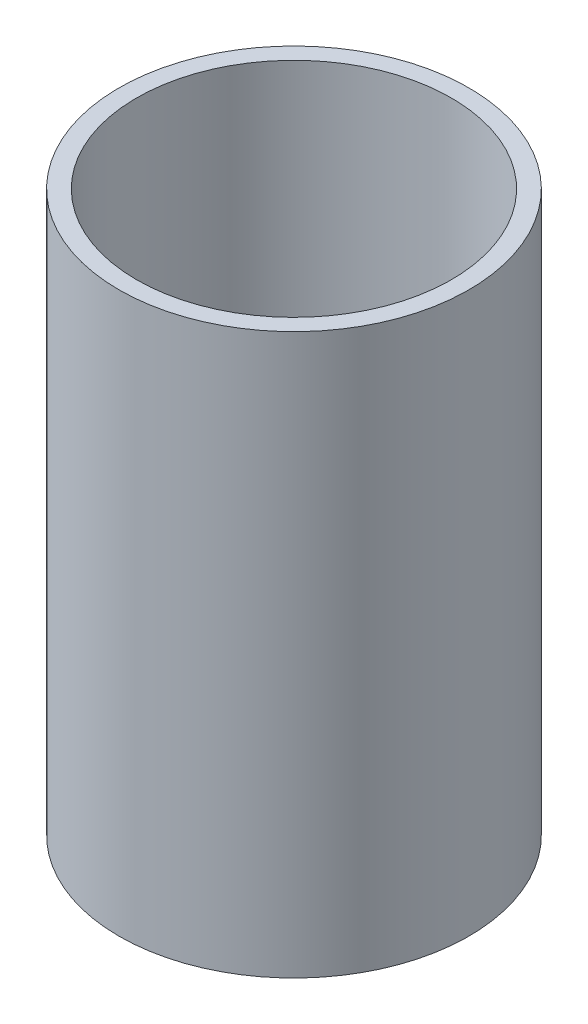
ISO-10303-21;
HEADER;
FILE_DESCRIPTION(('STEP AP214'),'2;1');
FILE_NAME('part.step','',(''),(''),'','','');
FILE_SCHEMA(('AUTOMOTIVE_DESIGN { 1 0 10303 214 1 1 1 1 }'));
ENDSEC;
DATA;
#1=APPLICATION_CONTEXT('core data for automotive mechanical design processes');
#2=APPLICATION_PROTOCOL_DEFINITION('international standard','automotive_design',2000,#1);
#3=PRODUCT_CONTEXT('',#1,'mechanical');
#4=PRODUCT('Part','Part','',(#3));
#5=PRODUCT_RELATED_PRODUCT_CATEGORY('part','',(#4));
#6=PRODUCT_DEFINITION_FORMATION('','',#4);
#7=PRODUCT_DEFINITION_CONTEXT('part definition',#1,'design');
#8=PRODUCT_DEFINITION('design','',#6,#7);
#9=PRODUCT_DEFINITION_SHAPE('','',#8);
#10=(LENGTH_UNIT() NAMED_UNIT(*) SI_UNIT(.MILLI.,.METRE.));
#11=(NAMED_UNIT(*) PLANE_ANGLE_UNIT() SI_UNIT($,.RADIAN.));
#12=(NAMED_UNIT(*) SI_UNIT($,.STERADIAN.) SOLID_ANGLE_UNIT());
#13=UNCERTAINTY_MEASURE_WITH_UNIT(LENGTH_MEASURE(1.E-05),#10,'distance_accuracy_value','');
#14=(GEOMETRIC_REPRESENTATION_CONTEXT(3) GLOBAL_UNCERTAINTY_ASSIGNED_CONTEXT((#13)) GLOBAL_UNIT_ASSIGNED_CONTEXT((#10,
#11,#12)) REPRESENTATION_CONTEXT('',''));
#15=CARTESIAN_POINT('',(0.,0.,0.));
#16=DIRECTION('',(0.,0.,1.));
#17=DIRECTION('',(1.,0.,0.));
#18=AXIS2_PLACEMENT_3D('',#15,#16,#17);
#19=CARTESIAN_POINT('',(-3.48784965253497,8.,-0.992620989889692));
#20=DIRECTION('',(0.,-1.,0.));
#21=DIRECTION('',(0.,0.,-1.));
#22=AXIS2_PLACEMENT_3D('',#19,#20,#21);
#23=CYLINDRICAL_SURFACE('',#22,2.5);
#24=CARTESIAN_POINT('',(-3.48784965253497,8.,-0.992620989889692));
#25=DIRECTION('',(0.,1.,0.));
#26=DIRECTION('',(0.,0.,1.));
#27=AXIS2_PLACEMENT_3D('',#24,#25,#26);
#28=CIRCLE('',#27,2.5);
#29=CARTESIAN_POINT('',(-3.48784965253497,8.,1.50737901011031));
#30=VERTEX_POINT('',#29);
#31=EDGE_CURVE('E10',#30,#30,#28,.T.);
#32=ORIENTED_EDGE('',*,*,#31,.F.);
#33=EDGE_LOOP('',(#32));
#34=FACE_BOUND('',#33,.T.);
#35=CARTESIAN_POINT('',(-3.48784965253497,0.,-0.992620989889692));
#36=DIRECTION('',(0.,1.,0.));
#37=DIRECTION('',(0.,0.,1.));
#38=AXIS2_PLACEMENT_3D('',#35,#36,#37);
#39=CIRCLE('',#38,2.5);
#40=CARTESIAN_POINT('',(-3.48784965253497,0.,1.50737901011031));
#41=VERTEX_POINT('',#40);
#42=EDGE_CURVE('E41',#41,#41,#39,.T.);
#43=ORIENTED_EDGE('',*,*,#42,.T.);
#44=EDGE_LOOP('',(#43));
#45=FACE_BOUND('',#44,.T.);
#46=ADVANCED_FACE('F38',(#34,#45),#23,.T.);
#47=CARTESIAN_POINT('',(-3.48784965253497,8.,-0.992620989889692));
#48=DIRECTION('',(0.,1.,0.));
#49=DIRECTION('',(0.,0.,1.));
#50=AXIS2_PLACEMENT_3D('',#47,#48,#49);
#51=PLANE('',#50);
#52=CARTESIAN_POINT('',(-3.48784965253497,8.,-0.992620989889692));
#53=DIRECTION('',(0.,1.,0.));
#54=DIRECTION('',(0.,0.,1.));
#55=AXIS2_PLACEMENT_3D('',#52,#53,#54);
#56=CIRCLE('',#55,2.25);
#57=CARTESIAN_POINT('',(-3.48784965253497,8.,1.25737901011031));
#58=VERTEX_POINT('',#57);
#59=EDGE_CURVE('E50',#58,#58,#56,.T.);
#60=ORIENTED_EDGE('',*,*,#59,.F.);
#61=EDGE_LOOP('',(#60));
#62=FACE_BOUND('',#61,.T.);
#63=ORIENTED_EDGE('',*,*,#31,.T.);
#64=EDGE_LOOP('',(#63));
#65=FACE_BOUND('',#64,.T.);
#66=ADVANCED_FACE('F65',(#62,#65),#51,.T.);
#67=CARTESIAN_POINT('',(-3.48784965253497,0.,-0.992620989889692));
#68=DIRECTION('',(0.,1.,0.));
#69=DIRECTION('',(0.,0.,1.));
#70=AXIS2_PLACEMENT_3D('',#67,#68,#69);
#71=PLANE('',#70);
#72=ORIENTED_EDGE('',*,*,#42,.F.);
#73=EDGE_LOOP('',(#72));
#74=FACE_BOUND('',#73,.T.);
#75=ADVANCED_FACE('F61',(#74),#71,.F.);
#76=CARTESIAN_POINT('',(-3.48784965253497,0.8,-0.992620989889692));
#77=DIRECTION('',(0.,1.,0.));
#78=DIRECTION('',(0.,0.,1.));
#79=AXIS2_PLACEMENT_3D('',#76,#77,#78);
#80=CYLINDRICAL_SURFACE('',#79,2.25);
#81=CARTESIAN_POINT('',(-3.48784965253497,0.8,-0.992620989889692));
#82=DIRECTION('',(0.,1.,0.));
#83=DIRECTION('',(0.,0.,1.));
#84=AXIS2_PLACEMENT_3D('',#81,#82,#83);
#85=CIRCLE('',#84,2.25);
#86=CARTESIAN_POINT('',(-3.48784965253497,0.8,1.25737901011031));
#87=VERTEX_POINT('',#86);
#88=EDGE_CURVE('E48',#87,#87,#85,.T.);
#89=ORIENTED_EDGE('',*,*,#88,.F.);
#90=EDGE_LOOP('',(#89));
#91=FACE_BOUND('',#90,.T.);
#92=ORIENTED_EDGE('',*,*,#59,.T.);
#93=EDGE_LOOP('',(#92));
#94=FACE_BOUND('',#93,.T.);
#95=ADVANCED_FACE('F58',(#91,#94),#80,.F.);
#96=CARTESIAN_POINT('',(-3.48784965253497,0.8,-0.992620989889692));
#97=DIRECTION('',(0.,1.,0.));
#98=DIRECTION('',(0.,0.,1.));
#99=AXIS2_PLACEMENT_3D('',#96,#97,#98);
#100=PLANE('',#99);
#101=ORIENTED_EDGE('',*,*,#88,.T.);
#102=EDGE_LOOP('',(#101));
#103=FACE_BOUND('',#102,.T.);
#104=ADVANCED_FACE('F56',(#103),#100,.T.);
#105=CLOSED_SHELL('',(#46,#66,#75,#95,#104));
#106=MANIFOLD_SOLID_BREP('B2',#105);
#107=ADVANCED_BREP_SHAPE_REPRESENTATION('',(#18,#106),#14);
#108=SHAPE_DEFINITION_REPRESENTATION(#9,#107);
ENDSEC;
END-ISO-10303-21;
